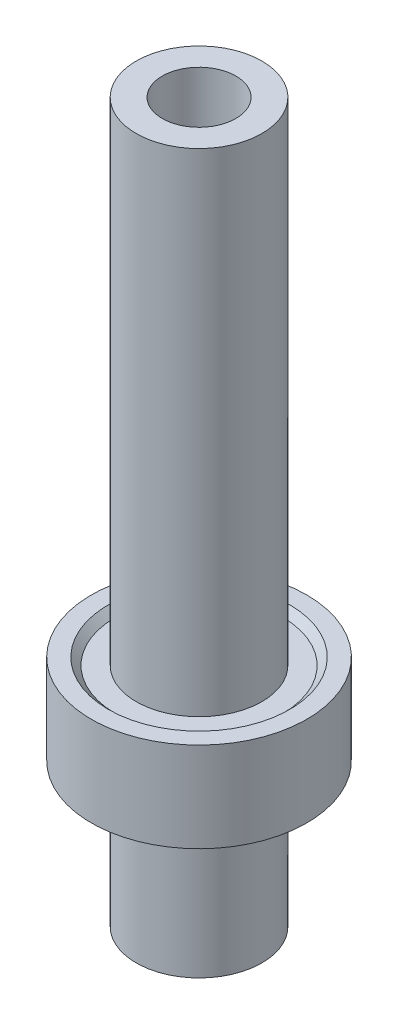
ISO-10303-21;
HEADER;
FILE_DESCRIPTION(('STEP AP214'),'2;1');
FILE_NAME('part.step','',(''),(''),'','','');
FILE_SCHEMA(('AUTOMOTIVE_DESIGN { 1 0 10303 214 1 1 1 1 }'));
ENDSEC;
DATA;
#1=APPLICATION_CONTEXT('core data for automotive mechanical design processes');
#2=APPLICATION_PROTOCOL_DEFINITION('international standard','automotive_design',2000,#1);
#3=PRODUCT_CONTEXT('',#1,'mechanical');
#4=PRODUCT('Part','Part','',(#3));
#5=PRODUCT_RELATED_PRODUCT_CATEGORY('part','',(#4));
#6=PRODUCT_DEFINITION_FORMATION('','',#4);
#7=PRODUCT_DEFINITION_CONTEXT('part definition',#1,'design');
#8=PRODUCT_DEFINITION('design','',#6,#7);
#9=PRODUCT_DEFINITION_SHAPE('','',#8);
#10=(LENGTH_UNIT() NAMED_UNIT(*) SI_UNIT(.MILLI.,.METRE.));
#11=(NAMED_UNIT(*) PLANE_ANGLE_UNIT() SI_UNIT($,.RADIAN.));
#12=(NAMED_UNIT(*) SI_UNIT($,.STERADIAN.) SOLID_ANGLE_UNIT());
#13=UNCERTAINTY_MEASURE_WITH_UNIT(LENGTH_MEASURE(1.E-05),#10,'distance_accuracy_value','');
#14=(GEOMETRIC_REPRESENTATION_CONTEXT(3) GLOBAL_UNCERTAINTY_ASSIGNED_CONTEXT((#13)) GLOBAL_UNIT_ASSIGNED_CONTEXT((#10,
#11,#12)) REPRESENTATION_CONTEXT('',''));
#15=CARTESIAN_POINT('',(0.,0.,0.));
#16=DIRECTION('',(0.,0.,1.));
#17=DIRECTION('',(1.,0.,0.));
#18=AXIS2_PLACEMENT_3D('',#15,#16,#17);
#19=CARTESIAN_POINT('',(0.,0.,-17.5));
#20=DIRECTION('',(0.,-1.,0.));
#21=DIRECTION('',(0.,0.,-1.));
#22=AXIS2_PLACEMENT_3D('',#19,#20,#21);
#23=PLANE('',#22);
#24=CARTESIAN_POINT('',(0.,0.,0.));
#25=DIRECTION('',(0.,-1.,0.));
#26=DIRECTION('',(0.,0.,-1.));
#27=AXIS2_PLACEMENT_3D('',#24,#25,#26);
#28=CIRCLE('',#27,17.5);
#29=CARTESIAN_POINT('',(0.,0.,-17.5));
#30=VERTEX_POINT('',#29);
#31=EDGE_CURVE('E79',#30,#30,#28,.T.);
#32=ORIENTED_EDGE('',*,*,#31,.T.);
#33=EDGE_LOOP('',(#32));
#34=FACE_BOUND('',#33,.T.);
#35=CARTESIAN_POINT('',(0.,0.,0.));
#36=DIRECTION('',(0.,-1.,0.));
#37=DIRECTION('',(0.,0.,-1.));
#38=AXIS2_PLACEMENT_3D('',#35,#36,#37);
#39=CIRCLE('',#38,10.25);
#40=CARTESIAN_POINT('',(0.,0.,-10.25));
#41=VERTEX_POINT('',#40);
#42=EDGE_CURVE('E12',#41,#41,#39,.T.);
#43=ORIENTED_EDGE('',*,*,#42,.F.);
#44=EDGE_LOOP('',(#43));
#45=FACE_BOUND('',#44,.T.);
#46=ADVANCED_FACE('F45',(#34,#45),#23,.T.);
#47=CARTESIAN_POINT('',(0.,0.,0.));
#48=DIRECTION('',(0.,-1.,0.));
#49=DIRECTION('',(0.,0.,-1.));
#50=AXIS2_PLACEMENT_3D('',#47,#48,#49);
#51=CYLINDRICAL_SURFACE('',#50,10.25);
#52=ORIENTED_EDGE('',*,*,#42,.T.);
#53=EDGE_LOOP('',(#52));
#54=FACE_BOUND('',#53,.T.);
#55=CARTESIAN_POINT('',(0.,200.,0.));
#56=DIRECTION('',(0.,-1.,0.));
#57=DIRECTION('',(0.,0.,-1.));
#58=AXIS2_PLACEMENT_3D('',#55,#56,#57);
#59=CIRCLE('',#58,10.25);
#60=CARTESIAN_POINT('',(0.,200.,-10.25));
#61=VERTEX_POINT('',#60);
#62=EDGE_CURVE('E51',#61,#61,#59,.T.);
#63=ORIENTED_EDGE('',*,*,#62,.F.);
#64=EDGE_LOOP('',(#63));
#65=FACE_BOUND('',#64,.T.);
#66=ADVANCED_FACE('F97',(#54,#65),#51,.F.);
#67=CARTESIAN_POINT('',(0.,200.,-10.25));
#68=DIRECTION('',(0.,1.,0.));
#69=DIRECTION('',(0.,0.,1.));
#70=AXIS2_PLACEMENT_3D('',#67,#68,#69);
#71=PLANE('',#70);
#72=ORIENTED_EDGE('',*,*,#62,.T.);
#73=EDGE_LOOP('',(#72));
#74=FACE_BOUND('',#73,.T.);
#75=CARTESIAN_POINT('',(0.,200.,0.));
#76=DIRECTION('',(0.,-1.,0.));
#77=DIRECTION('',(0.,0.,-1.));
#78=AXIS2_PLACEMENT_3D('',#75,#76,#77);
#79=CIRCLE('',#78,17.5);
#80=CARTESIAN_POINT('',(0.,200.,-17.5));
#81=VERTEX_POINT('',#80);
#82=EDGE_CURVE('E55',#81,#81,#79,.T.);
#83=ORIENTED_EDGE('',*,*,#82,.F.);
#84=EDGE_LOOP('',(#83));
#85=FACE_BOUND('',#84,.T.);
#86=ADVANCED_FACE('F101',(#74,#85),#71,.T.);
#87=CARTESIAN_POINT('',(0.,0.,0.));
#88=DIRECTION('',(0.,-1.,0.));
#89=DIRECTION('',(0.,0.,-1.));
#90=AXIS2_PLACEMENT_3D('',#87,#88,#89);
#91=CYLINDRICAL_SURFACE('',#90,17.5);
#92=ORIENTED_EDGE('',*,*,#82,.T.);
#93=EDGE_LOOP('',(#92));
#94=FACE_BOUND('',#93,.T.);
#95=CARTESIAN_POINT('',(0.,63.,0.));
#96=DIRECTION('',(0.,-1.,0.));
#97=DIRECTION('',(0.,0.,-1.));
#98=AXIS2_PLACEMENT_3D('',#95,#96,#97);
#99=CIRCLE('',#98,17.5);
#100=CARTESIAN_POINT('',(0.,63.,-17.5));
#101=VERTEX_POINT('',#100);
#102=EDGE_CURVE('E59',#101,#101,#99,.T.);
#103=ORIENTED_EDGE('',*,*,#102,.F.);
#104=EDGE_LOOP('',(#103));
#105=FACE_BOUND('',#104,.T.);
#106=ADVANCED_FACE('F105',(#94,#105),#91,.T.);
#107=CARTESIAN_POINT('',(0.,63.,-23.25));
#108=DIRECTION('',(0.,1.,0.));
#109=DIRECTION('',(0.,0.,1.));
#110=AXIS2_PLACEMENT_3D('',#107,#108,#109);
#111=PLANE('',#110);
#112=ORIENTED_EDGE('',*,*,#102,.T.);
#113=EDGE_LOOP('',(#112));
#114=FACE_BOUND('',#113,.T.);
#115=CARTESIAN_POINT('',(0.,63.,0.));
#116=DIRECTION('',(0.,-1.,0.));
#117=DIRECTION('',(0.,0.,-1.));
#118=AXIS2_PLACEMENT_3D('',#115,#116,#117);
#119=CIRCLE('',#118,23.25);
#120=CARTESIAN_POINT('',(0.,63.,-23.25));
#121=VERTEX_POINT('',#120);
#122=EDGE_CURVE('E64',#121,#121,#119,.T.);
#123=ORIENTED_EDGE('',*,*,#122,.F.);
#124=EDGE_LOOP('',(#123));
#125=FACE_BOUND('',#124,.T.);
#126=ADVANCED_FACE('F111',(#114,#125),#111,.T.);
#127=CARTESIAN_POINT('',(0.,65.,0.));
#128=DIRECTION('',(0.,1.,0.));
#129=DIRECTION('',(0.,0.,1.));
#130=AXIS2_PLACEMENT_3D('',#127,#128,#129);
#131=CONICAL_SURFACE('',#130,25.25,0.785398163397452);
#132=ORIENTED_EDGE('',*,*,#122,.T.);
#133=EDGE_LOOP('',(#132));
#134=FACE_BOUND('',#133,.T.);
#135=CARTESIAN_POINT('',(0.,65.,0.));
#136=DIRECTION('',(0.,-1.,0.));
#137=DIRECTION('',(0.,0.,-1.));
#138=AXIS2_PLACEMENT_3D('',#135,#136,#137);
#139=CIRCLE('',#138,25.25);
#140=CARTESIAN_POINT('',(0.,65.,-25.25));
#141=VERTEX_POINT('',#140);
#142=EDGE_CURVE('E67',#141,#141,#139,.T.);
#143=ORIENTED_EDGE('',*,*,#142,.F.);
#144=EDGE_LOOP('',(#143));
#145=FACE_BOUND('',#144,.T.);
#146=ADVANCED_FACE('F115',(#134,#145),#131,.F.);
#147=CARTESIAN_POINT('',(0.,65.,-25.25));
#148=DIRECTION('',(0.,1.,0.));
#149=DIRECTION('',(0.,0.,1.));
#150=AXIS2_PLACEMENT_3D('',#147,#148,#149);
#151=PLANE('',#150);
#152=ORIENTED_EDGE('',*,*,#142,.T.);
#153=EDGE_LOOP('',(#152));
#154=FACE_BOUND('',#153,.T.);
#155=CARTESIAN_POINT('',(0.,65.,0.));
#156=DIRECTION('',(0.,-1.,0.));
#157=DIRECTION('',(0.,0.,-1.));
#158=AXIS2_PLACEMENT_3D('',#155,#156,#157);
#159=CIRCLE('',#158,30.);
#160=CARTESIAN_POINT('',(0.,65.,-30.));
#161=VERTEX_POINT('',#160);
#162=EDGE_CURVE('E70',#161,#161,#159,.T.);
#163=ORIENTED_EDGE('',*,*,#162,.F.);
#164=EDGE_LOOP('',(#163));
#165=FACE_BOUND('',#164,.T.);
#166=ADVANCED_FACE('F119',(#154,#165),#151,.T.);
#167=CARTESIAN_POINT('',(0.,0.,0.));
#168=DIRECTION('',(0.,-1.,0.));
#169=DIRECTION('',(0.,0.,-1.));
#170=AXIS2_PLACEMENT_3D('',#167,#168,#169);
#171=CYLINDRICAL_SURFACE('',#170,30.);
#172=ORIENTED_EDGE('',*,*,#162,.T.);
#173=EDGE_LOOP('',(#172));
#174=FACE_BOUND('',#173,.T.);
#175=CARTESIAN_POINT('',(0.,40.,0.));
#176=DIRECTION('',(0.,-1.,0.));
#177=DIRECTION('',(0.,0.,-1.));
#178=AXIS2_PLACEMENT_3D('',#175,#176,#177);
#179=CIRCLE('',#178,30.);
#180=CARTESIAN_POINT('',(0.,40.,-30.));
#181=VERTEX_POINT('',#180);
#182=EDGE_CURVE('E73',#181,#181,#179,.T.);
#183=ORIENTED_EDGE('',*,*,#182,.F.);
#184=EDGE_LOOP('',(#183));
#185=FACE_BOUND('',#184,.T.);
#186=ADVANCED_FACE('F93',(#174,#185),#171,.T.);
#187=CARTESIAN_POINT('',(0.,40.,-30.));
#188=DIRECTION('',(0.,-1.,0.));
#189=DIRECTION('',(0.,0.,-1.));
#190=AXIS2_PLACEMENT_3D('',#187,#188,#189);
#191=PLANE('',#190);
#192=ORIENTED_EDGE('',*,*,#182,.T.);
#193=EDGE_LOOP('',(#192));
#194=FACE_BOUND('',#193,.T.);
#195=CARTESIAN_POINT('',(0.,40.,0.));
#196=DIRECTION('',(0.,-1.,0.));
#197=DIRECTION('',(0.,0.,-1.));
#198=AXIS2_PLACEMENT_3D('',#195,#196,#197);
#199=CIRCLE('',#198,17.5);
#200=CARTESIAN_POINT('',(0.,40.,-17.5));
#201=VERTEX_POINT('',#200);
#202=EDGE_CURVE('E76',#201,#201,#199,.T.);
#203=ORIENTED_EDGE('',*,*,#202,.F.);
#204=EDGE_LOOP('',(#203));
#205=FACE_BOUND('',#204,.T.);
#206=ADVANCED_FACE('F87',(#194,#205),#191,.T.);
#207=CARTESIAN_POINT('',(0.,0.,0.));
#208=DIRECTION('',(0.,-1.,0.));
#209=DIRECTION('',(0.,0.,-1.));
#210=AXIS2_PLACEMENT_3D('',#207,#208,#209);
#211=CYLINDRICAL_SURFACE('',#210,17.5);
#212=ORIENTED_EDGE('',*,*,#202,.T.);
#213=EDGE_LOOP('',(#212));
#214=FACE_BOUND('',#213,.T.);
#215=ORIENTED_EDGE('',*,*,#31,.F.);
#216=EDGE_LOOP('',(#215));
#217=FACE_BOUND('',#216,.T.);
#218=ADVANCED_FACE('F85',(#214,#217),#211,.T.);
#219=CLOSED_SHELL('',(#46,#66,#86,#106,#126,#146,#166,#186,#206,#218));
#220=MANIFOLD_SOLID_BREP('B2',#219);
#221=ADVANCED_BREP_SHAPE_REPRESENTATION('',(#18,#220),#14);
#222=SHAPE_DEFINITION_REPRESENTATION(#9,#221);
ENDSEC;
END-ISO-10303-21;
